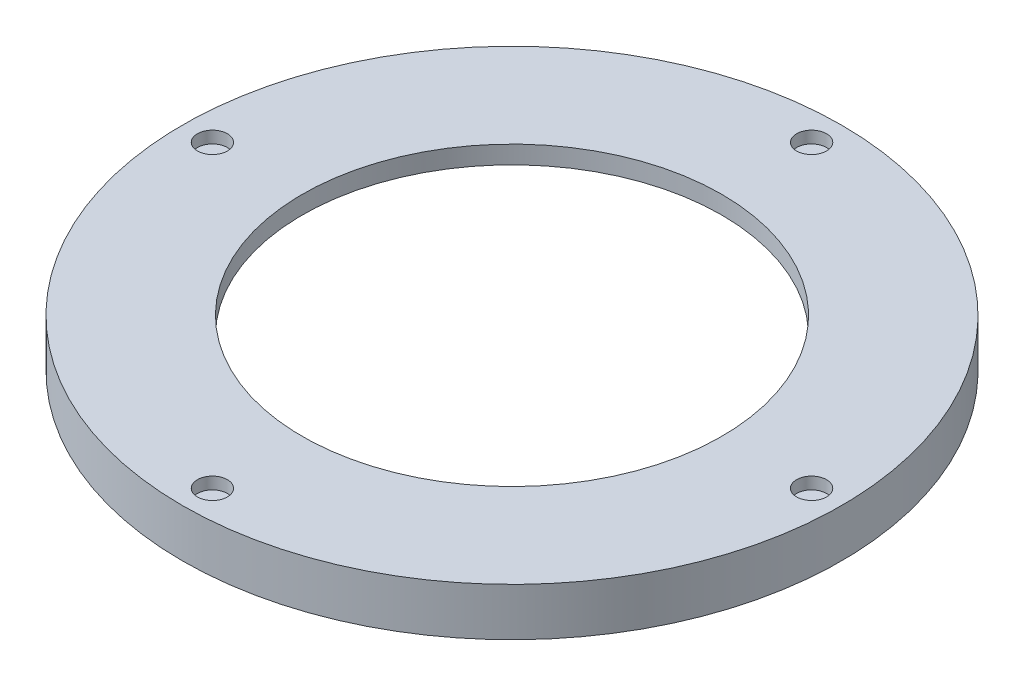
ISO-10303-21;
HEADER;
FILE_DESCRIPTION(('STEP AP214'),'2;1');
FILE_NAME('part.step','',(''),(''),'','','');
FILE_SCHEMA(('AUTOMOTIVE_DESIGN { 1 0 10303 214 1 1 1 1 }'));
ENDSEC;
DATA;
#1=APPLICATION_CONTEXT('core data for automotive mechanical design processes');
#2=APPLICATION_PROTOCOL_DEFINITION('international standard','automotive_design',2000,#1);
#3=PRODUCT_CONTEXT('',#1,'mechanical');
#4=PRODUCT('Part','Part','',(#3));
#5=PRODUCT_RELATED_PRODUCT_CATEGORY('part','',(#4));
#6=PRODUCT_DEFINITION_FORMATION('','',#4);
#7=PRODUCT_DEFINITION_CONTEXT('part definition',#1,'design');
#8=PRODUCT_DEFINITION('design','',#6,#7);
#9=PRODUCT_DEFINITION_SHAPE('','',#8);
#10=(LENGTH_UNIT() NAMED_UNIT(*) SI_UNIT(.MILLI.,.METRE.));
#11=(NAMED_UNIT(*) PLANE_ANGLE_UNIT() SI_UNIT($,.RADIAN.));
#12=(NAMED_UNIT(*) SI_UNIT($,.STERADIAN.) SOLID_ANGLE_UNIT());
#13=UNCERTAINTY_MEASURE_WITH_UNIT(LENGTH_MEASURE(1.E-05),#10,'distance_accuracy_value','');
#14=(GEOMETRIC_REPRESENTATION_CONTEXT(3) GLOBAL_UNCERTAINTY_ASSIGNED_CONTEXT((#13)) GLOBAL_UNIT_ASSIGNED_CONTEXT((#10,
#11,#12)) REPRESENTATION_CONTEXT('',''));
#15=CARTESIAN_POINT('',(0.,0.,0.));
#16=DIRECTION('',(0.,0.,1.));
#17=DIRECTION('',(1.,0.,0.));
#18=AXIS2_PLACEMENT_3D('',#15,#16,#17);
#19=CARTESIAN_POINT('',(0.,4.,0.));
#20=DIRECTION('',(0.,-1.,0.));
#21=DIRECTION('',(0.,0.,-1.));
#22=AXIS2_PLACEMENT_3D('',#19,#20,#21);
#23=CYLINDRICAL_SURFACE('',#22,27.5);
#24=CARTESIAN_POINT('',(0.,4.,0.));
#25=DIRECTION('',(0.,1.,0.));
#26=DIRECTION('',(0.,0.,1.));
#27=AXIS2_PLACEMENT_3D('',#24,#25,#26);
#28=CIRCLE('',#27,27.5);
#29=CARTESIAN_POINT('',(0.,4.,27.5));
#30=VERTEX_POINT('',#29);
#31=EDGE_CURVE('E10',#30,#30,#28,.T.);
#32=ORIENTED_EDGE('',*,*,#31,.F.);
#33=EDGE_LOOP('',(#32));
#34=FACE_BOUND('',#33,.T.);
#35=CARTESIAN_POINT('',(0.,0.,0.));
#36=DIRECTION('',(0.,1.,0.));
#37=DIRECTION('',(0.,0.,1.));
#38=AXIS2_PLACEMENT_3D('',#35,#36,#37);
#39=CIRCLE('',#38,27.5);
#40=CARTESIAN_POINT('',(0.,0.,27.5));
#41=VERTEX_POINT('',#40);
#42=EDGE_CURVE('E34',#41,#41,#39,.T.);
#43=ORIENTED_EDGE('',*,*,#42,.T.);
#44=EDGE_LOOP('',(#43));
#45=FACE_BOUND('',#44,.T.);
#46=ADVANCED_FACE('F31',(#34,#45),#23,.T.);
#47=CARTESIAN_POINT('',(0.,4.,0.));
#48=DIRECTION('',(0.,1.,0.));
#49=DIRECTION('',(0.,0.,1.));
#50=AXIS2_PLACEMENT_3D('',#47,#48,#49);
#51=PLANE('',#50);
#52=CARTESIAN_POINT('',(0.,4.,0.));
#53=DIRECTION('',(0.,-1.,0.));
#54=DIRECTION('',(0.,0.,-1.));
#55=AXIS2_PLACEMENT_3D('',#52,#53,#54);
#56=CIRCLE('',#55,17.5);
#57=CARTESIAN_POINT('',(0.,4.,-17.5));
#58=VERTEX_POINT('',#57);
#59=EDGE_CURVE('E70',#58,#58,#56,.T.);
#60=ORIENTED_EDGE('',*,*,#59,.T.);
#61=EDGE_LOOP('',(#60));
#62=FACE_BOUND('',#61,.T.);
#63=CARTESIAN_POINT('',(0.,4.,-25.));
#64=DIRECTION('',(0.,1.,0.));
#65=DIRECTION('',(0.,0.,1.));
#66=AXIS2_PLACEMENT_3D('',#63,#64,#65);
#67=CIRCLE('',#66,1.25);
#68=CARTESIAN_POINT('',(0.,4.,-23.75));
#69=VERTEX_POINT('',#68);
#70=EDGE_CURVE('E62',#69,#69,#67,.T.);
#71=ORIENTED_EDGE('',*,*,#70,.F.);
#72=EDGE_LOOP('',(#71));
#73=FACE_BOUND('',#72,.T.);
#74=CARTESIAN_POINT('',(25.,4.,0.));
#75=DIRECTION('',(0.,1.,0.));
#76=DIRECTION('',(0.,0.,1.));
#77=AXIS2_PLACEMENT_3D('',#74,#75,#76);
#78=CIRCLE('',#77,1.25);
#79=CARTESIAN_POINT('',(25.,4.,1.25));
#80=VERTEX_POINT('',#79);
#81=EDGE_CURVE('E56',#80,#80,#78,.T.);
#82=ORIENTED_EDGE('',*,*,#81,.F.);
#83=EDGE_LOOP('',(#82));
#84=FACE_BOUND('',#83,.T.);
#85=CARTESIAN_POINT('',(0.,4.,25.));
#86=DIRECTION('',(0.,1.,0.));
#87=DIRECTION('',(0.,0.,1.));
#88=AXIS2_PLACEMENT_3D('',#85,#86,#87);
#89=CIRCLE('',#88,1.25);
#90=CARTESIAN_POINT('',(0.,4.,26.25));
#91=VERTEX_POINT('',#90);
#92=EDGE_CURVE('E50',#91,#91,#89,.T.);
#93=ORIENTED_EDGE('',*,*,#92,.F.);
#94=EDGE_LOOP('',(#93));
#95=FACE_BOUND('',#94,.T.);
#96=CARTESIAN_POINT('',(-25.,4.,0.));
#97=DIRECTION('',(0.,1.,0.));
#98=DIRECTION('',(0.,0.,1.));
#99=AXIS2_PLACEMENT_3D('',#96,#97,#98);
#100=CIRCLE('',#99,1.25);
#101=CARTESIAN_POINT('',(-25.,4.,1.25));
#102=VERTEX_POINT('',#101);
#103=EDGE_CURVE('E43',#102,#102,#100,.T.);
#104=ORIENTED_EDGE('',*,*,#103,.F.);
#105=EDGE_LOOP('',(#104));
#106=FACE_BOUND('',#105,.T.);
#107=ORIENTED_EDGE('',*,*,#31,.T.);
#108=EDGE_LOOP('',(#107));
#109=FACE_BOUND('',#108,.T.);
#110=ADVANCED_FACE('F79',(#62,#73,#84,#95,#106,#109),#51,.T.);
#111=CARTESIAN_POINT('',(0.,0.,0.));
#112=DIRECTION('',(0.,1.,0.));
#113=DIRECTION('',(0.,0.,1.));
#114=AXIS2_PLACEMENT_3D('',#111,#112,#113);
#115=PLANE('',#114);
#116=CARTESIAN_POINT('',(0.,0.,0.));
#117=DIRECTION('',(0.,-1.,0.));
#118=DIRECTION('',(0.,0.,-1.));
#119=AXIS2_PLACEMENT_3D('',#116,#117,#118);
#120=CIRCLE('',#119,25.);
#121=CARTESIAN_POINT('',(0.,0.,-25.));
#122=VERTEX_POINT('',#121);
#123=EDGE_CURVE('E67',#122,#122,#120,.T.);
#124=ORIENTED_EDGE('',*,*,#123,.F.);
#125=EDGE_LOOP('',(#124));
#126=FACE_BOUND('',#125,.T.);
#127=ORIENTED_EDGE('',*,*,#42,.F.);
#128=EDGE_LOOP('',(#127));
#129=FACE_BOUND('',#128,.T.);
#130=ADVANCED_FACE('F101',(#126,#129),#115,.F.);
#131=CARTESIAN_POINT('',(-25.,3.,0.));
#132=DIRECTION('',(0.,1.,0.));
#133=DIRECTION('',(0.,0.,1.));
#134=AXIS2_PLACEMENT_3D('',#131,#132,#133);
#135=CYLINDRICAL_SURFACE('',#134,1.25);
#136=CARTESIAN_POINT('',(-25.,3.,0.));
#137=DIRECTION('',(0.,1.,0.));
#138=DIRECTION('',(0.,0.,1.));
#139=AXIS2_PLACEMENT_3D('',#136,#137,#138);
#140=CIRCLE('',#139,1.25);
#141=CARTESIAN_POINT('',(-25.,3.,1.25));
#142=VERTEX_POINT('',#141);
#143=EDGE_CURVE('E46',#142,#142,#140,.T.);
#144=ORIENTED_EDGE('',*,*,#143,.F.);
#145=EDGE_LOOP('',(#144));
#146=FACE_BOUND('',#145,.T.);
#147=ORIENTED_EDGE('',*,*,#103,.T.);
#148=EDGE_LOOP('',(#147));
#149=FACE_BOUND('',#148,.T.);
#150=ADVANCED_FACE('F104',(#146,#149),#135,.F.);
#151=CARTESIAN_POINT('',(-25.,3.,0.));
#152=DIRECTION('',(0.,1.,0.));
#153=DIRECTION('',(0.,0.,1.));
#154=AXIS2_PLACEMENT_3D('',#151,#152,#153);
#155=PLANE('',#154);
#156=ORIENTED_EDGE('',*,*,#143,.T.);
#157=EDGE_LOOP('',(#156));
#158=FACE_BOUND('',#157,.T.);
#159=ADVANCED_FACE('F118',(#158),#155,.T.);
#160=CARTESIAN_POINT('',(0.,3.,25.));
#161=DIRECTION('',(0.,1.,0.));
#162=DIRECTION('',(0.,0.,1.));
#163=AXIS2_PLACEMENT_3D('',#160,#161,#162);
#164=CYLINDRICAL_SURFACE('',#163,1.25);
#165=CARTESIAN_POINT('',(0.,3.,25.));
#166=DIRECTION('',(0.,1.,0.));
#167=DIRECTION('',(0.,0.,1.));
#168=AXIS2_PLACEMENT_3D('',#165,#166,#167);
#169=CIRCLE('',#168,1.25);
#170=CARTESIAN_POINT('',(0.,3.,26.25));
#171=VERTEX_POINT('',#170);
#172=EDGE_CURVE('E53',#171,#171,#169,.T.);
#173=ORIENTED_EDGE('',*,*,#172,.F.);
#174=EDGE_LOOP('',(#173));
#175=FACE_BOUND('',#174,.T.);
#176=ORIENTED_EDGE('',*,*,#92,.T.);
#177=EDGE_LOOP('',(#176));
#178=FACE_BOUND('',#177,.T.);
#179=ADVANCED_FACE('F122',(#175,#178),#164,.F.);
#180=CARTESIAN_POINT('',(0.,3.,25.));
#181=DIRECTION('',(0.,1.,0.));
#182=DIRECTION('',(0.,0.,1.));
#183=AXIS2_PLACEMENT_3D('',#180,#181,#182);
#184=PLANE('',#183);
#185=ORIENTED_EDGE('',*,*,#172,.T.);
#186=EDGE_LOOP('',(#185));
#187=FACE_BOUND('',#186,.T.);
#188=ADVANCED_FACE('F126',(#187),#184,.T.);
#189=CARTESIAN_POINT('',(25.,3.,0.));
#190=DIRECTION('',(0.,1.,0.));
#191=DIRECTION('',(0.,0.,1.));
#192=AXIS2_PLACEMENT_3D('',#189,#190,#191);
#193=CYLINDRICAL_SURFACE('',#192,1.25);
#194=CARTESIAN_POINT('',(25.,3.,0.));
#195=DIRECTION('',(0.,1.,0.));
#196=DIRECTION('',(0.,0.,1.));
#197=AXIS2_PLACEMENT_3D('',#194,#195,#196);
#198=CIRCLE('',#197,1.25);
#199=CARTESIAN_POINT('',(25.,3.,1.25));
#200=VERTEX_POINT('',#199);
#201=EDGE_CURVE('E59',#200,#200,#198,.T.);
#202=ORIENTED_EDGE('',*,*,#201,.F.);
#203=EDGE_LOOP('',(#202));
#204=FACE_BOUND('',#203,.T.);
#205=ORIENTED_EDGE('',*,*,#81,.T.);
#206=EDGE_LOOP('',(#205));
#207=FACE_BOUND('',#206,.T.);
#208=ADVANCED_FACE('F130',(#204,#207),#193,.F.);
#209=CARTESIAN_POINT('',(25.,3.,0.));
#210=DIRECTION('',(0.,1.,0.));
#211=DIRECTION('',(0.,0.,1.));
#212=AXIS2_PLACEMENT_3D('',#209,#210,#211);
#213=PLANE('',#212);
#214=ORIENTED_EDGE('',*,*,#201,.T.);
#215=EDGE_LOOP('',(#214));
#216=FACE_BOUND('',#215,.T.);
#217=ADVANCED_FACE('F134',(#216),#213,.T.);
#218=CARTESIAN_POINT('',(0.,3.,-25.));
#219=DIRECTION('',(0.,1.,0.));
#220=DIRECTION('',(0.,0.,1.));
#221=AXIS2_PLACEMENT_3D('',#218,#219,#220);
#222=CYLINDRICAL_SURFACE('',#221,1.25);
#223=CARTESIAN_POINT('',(0.,3.,-25.));
#224=DIRECTION('',(0.,1.,0.));
#225=DIRECTION('',(0.,0.,1.));
#226=AXIS2_PLACEMENT_3D('',#223,#224,#225);
#227=CIRCLE('',#226,1.25);
#228=CARTESIAN_POINT('',(0.,3.,-23.75));
#229=VERTEX_POINT('',#228);
#230=EDGE_CURVE('E41',#229,#229,#227,.T.);
#231=ORIENTED_EDGE('',*,*,#230,.F.);
#232=EDGE_LOOP('',(#231));
#233=FACE_BOUND('',#232,.T.);
#234=ORIENTED_EDGE('',*,*,#70,.T.);
#235=EDGE_LOOP('',(#234));
#236=FACE_BOUND('',#235,.T.);
#237=ADVANCED_FACE('F138',(#233,#236),#222,.F.);
#238=CARTESIAN_POINT('',(0.,3.,-25.));
#239=DIRECTION('',(0.,1.,0.));
#240=DIRECTION('',(0.,0.,1.));
#241=AXIS2_PLACEMENT_3D('',#238,#239,#240);
#242=PLANE('',#241);
#243=ORIENTED_EDGE('',*,*,#230,.T.);
#244=EDGE_LOOP('',(#243));
#245=FACE_BOUND('',#244,.T.);
#246=ADVANCED_FACE('F97',(#245),#242,.T.);
#247=CARTESIAN_POINT('',(0.,2.5,0.));
#248=DIRECTION('',(0.,-1.,0.));
#249=DIRECTION('',(0.,0.,-1.));
#250=AXIS2_PLACEMENT_3D('',#247,#248,#249);
#251=CYLINDRICAL_SURFACE('',#250,25.);
#252=CARTESIAN_POINT('',(0.,2.5,0.));
#253=DIRECTION('',(0.,-1.,0.));
#254=DIRECTION('',(0.,0.,-1.));
#255=AXIS2_PLACEMENT_3D('',#252,#253,#254);
#256=CIRCLE('',#255,25.);
#257=CARTESIAN_POINT('',(0.,2.5,-25.));
#258=VERTEX_POINT('',#257);
#259=EDGE_CURVE('E47',#258,#258,#256,.T.);
#260=ORIENTED_EDGE('',*,*,#259,.F.);
#261=EDGE_LOOP('',(#260));
#262=FACE_BOUND('',#261,.T.);
#263=ORIENTED_EDGE('',*,*,#123,.T.);
#264=EDGE_LOOP('',(#263));
#265=FACE_BOUND('',#264,.T.);
#266=ADVANCED_FACE('F91',(#262,#265),#251,.F.);
#267=CARTESIAN_POINT('',(0.,2.5,0.));
#268=DIRECTION('',(0.,-1.,0.));
#269=DIRECTION('',(0.,0.,-1.));
#270=AXIS2_PLACEMENT_3D('',#267,#268,#269);
#271=PLANE('',#270);
#272=CARTESIAN_POINT('',(0.,2.5,0.));
#273=DIRECTION('',(0.,-1.,0.));
#274=DIRECTION('',(0.,0.,-1.));
#275=AXIS2_PLACEMENT_3D('',#272,#273,#274);
#276=CIRCLE('',#275,17.5);
#277=CARTESIAN_POINT('',(0.,2.5,-17.5));
#278=VERTEX_POINT('',#277);
#279=EDGE_CURVE('E73',#278,#278,#276,.T.);
#280=ORIENTED_EDGE('',*,*,#279,.F.);
#281=EDGE_LOOP('',(#280));
#282=FACE_BOUND('',#281,.T.);
#283=ORIENTED_EDGE('',*,*,#259,.T.);
#284=EDGE_LOOP('',(#283));
#285=FACE_BOUND('',#284,.T.);
#286=ADVANCED_FACE('F85',(#282,#285),#271,.T.);
#287=CARTESIAN_POINT('',(0.,4.,0.));
#288=DIRECTION('',(0.,-1.,0.));
#289=DIRECTION('',(0.,0.,-1.));
#290=AXIS2_PLACEMENT_3D('',#287,#288,#289);
#291=CYLINDRICAL_SURFACE('',#290,17.5);
#292=ORIENTED_EDGE('',*,*,#59,.F.);
#293=EDGE_LOOP('',(#292));
#294=FACE_BOUND('',#293,.T.);
#295=ORIENTED_EDGE('',*,*,#279,.T.);
#296=EDGE_LOOP('',(#295));
#297=FACE_BOUND('',#296,.T.);
#298=ADVANCED_FACE('F82',(#294,#297),#291,.F.);
#299=CLOSED_SHELL('',(#46,#110,#130,#150,#159,#179,#188,#208,#217,#237,#246,#266,#286,#298));
#300=MANIFOLD_SOLID_BREP('B2',#299);
#301=ADVANCED_BREP_SHAPE_REPRESENTATION('',(#18,#300),#14);
#302=SHAPE_DEFINITION_REPRESENTATION(#9,#301);
ENDSEC;
END-ISO-10303-21;
